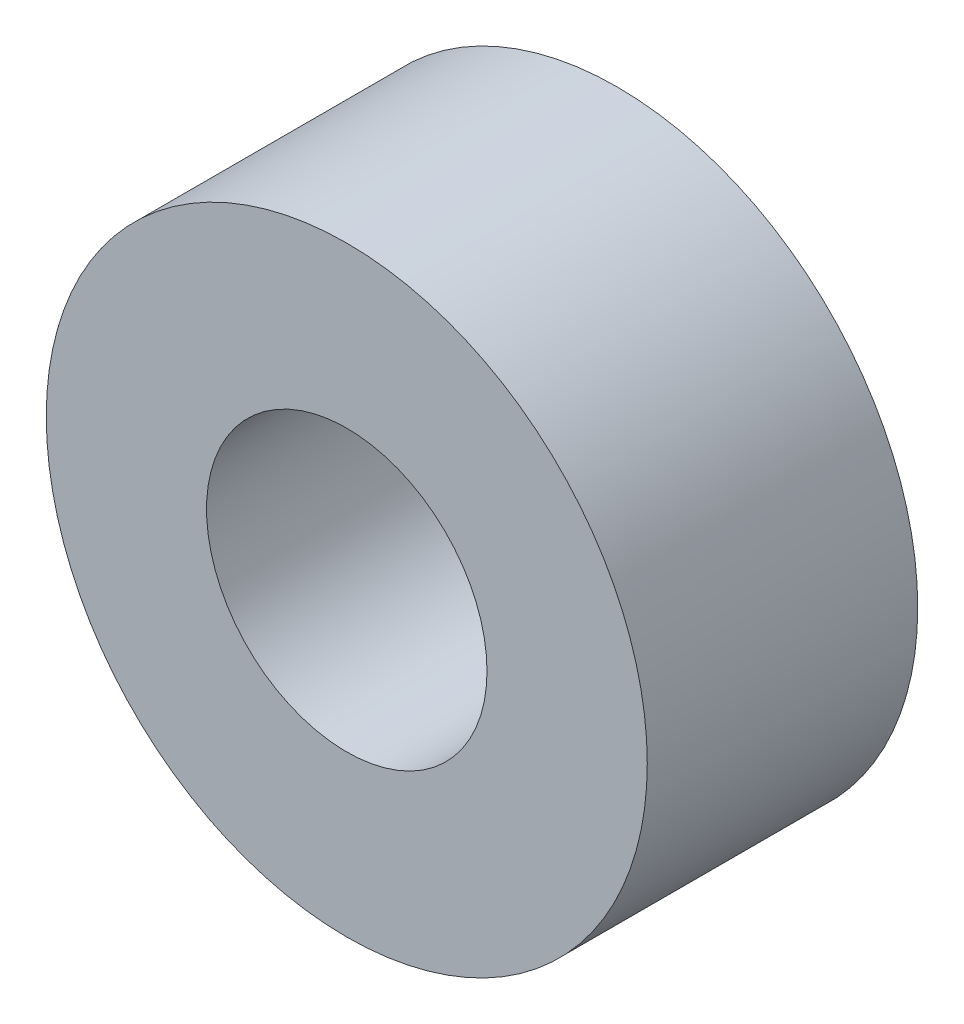
ISO-10303-21;
HEADER;
FILE_DESCRIPTION(('STEP AP214'),'2;1');
FILE_NAME('part.step','',(''),(''),'','','');
FILE_SCHEMA(('AUTOMOTIVE_DESIGN { 1 0 10303 214 1 1 1 1 }'));
ENDSEC;
DATA;
#1=APPLICATION_CONTEXT('core data for automotive mechanical design processes');
#2=APPLICATION_PROTOCOL_DEFINITION('international standard','automotive_design',2000,#1);
#3=PRODUCT_CONTEXT('',#1,'mechanical');
#4=PRODUCT('Part','Part','',(#3));
#5=PRODUCT_RELATED_PRODUCT_CATEGORY('part','',(#4));
#6=PRODUCT_DEFINITION_FORMATION('','',#4);
#7=PRODUCT_DEFINITION_CONTEXT('part definition',#1,'design');
#8=PRODUCT_DEFINITION('design','',#6,#7);
#9=PRODUCT_DEFINITION_SHAPE('','',#8);
#10=(LENGTH_UNIT() NAMED_UNIT(*) SI_UNIT(.MILLI.,.METRE.));
#11=(NAMED_UNIT(*) PLANE_ANGLE_UNIT() SI_UNIT($,.RADIAN.));
#12=(NAMED_UNIT(*) SI_UNIT($,.STERADIAN.) SOLID_ANGLE_UNIT());
#13=UNCERTAINTY_MEASURE_WITH_UNIT(LENGTH_MEASURE(1.E-05),#10,'distance_accuracy_value','');
#14=(GEOMETRIC_REPRESENTATION_CONTEXT(3) GLOBAL_UNCERTAINTY_ASSIGNED_CONTEXT((#13)) GLOBAL_UNIT_ASSIGNED_CONTEXT((#10,
#11,#12)) REPRESENTATION_CONTEXT('',''));
#15=CARTESIAN_POINT('',(0.,0.,0.));
#16=DIRECTION('',(0.,0.,1.));
#17=DIRECTION('',(1.,0.,0.));
#18=AXIS2_PLACEMENT_3D('',#15,#16,#17);
#19=CARTESIAN_POINT('',(0.,0.,-2.));
#20=DIRECTION('',(0.,0.,-1.));
#21=DIRECTION('',(1.,0.,0.));
#22=AXIS2_PLACEMENT_3D('',#19,#20,#21);
#23=PLANE('',#22);
#24=CARTESIAN_POINT('',(0.,0.,-2.));
#25=DIRECTION('',(0.,0.,1.));
#26=DIRECTION('',(1.,0.,0.));
#27=AXIS2_PLACEMENT_3D('',#24,#25,#26);
#28=CIRCLE('',#27,60.);
#29=CARTESIAN_POINT('',(60.,0.,-2.));
#30=VERTEX_POINT('',#29);
#31=EDGE_CURVE('E10',#30,#30,#28,.T.);
#32=ORIENTED_EDGE('',*,*,#31,.F.);
#33=EDGE_LOOP('',(#32));
#34=FACE_BOUND('',#33,.T.);
#35=CARTESIAN_POINT('',(0.,0.,-2.));
#36=DIRECTION('',(0.,0.,1.));
#37=DIRECTION('',(1.,0.,0.));
#38=AXIS2_PLACEMENT_3D('',#35,#36,#37);
#39=CIRCLE('',#38,28.);
#40=CARTESIAN_POINT('',(28.,0.,-2.));
#41=VERTEX_POINT('',#40);
#42=EDGE_CURVE('E42',#41,#41,#39,.T.);
#43=ORIENTED_EDGE('',*,*,#42,.T.);
#44=EDGE_LOOP('',(#43));
#45=FACE_BOUND('',#44,.T.);
#46=ADVANCED_FACE('F35',(#34,#45),#23,.T.);
#47=CARTESIAN_POINT('',(0.,0.,-2.));
#48=DIRECTION('',(0.,0.,1.));
#49=DIRECTION('',(-1.,0.,0.));
#50=AXIS2_PLACEMENT_3D('',#47,#48,#49);
#51=CYLINDRICAL_SURFACE('',#50,60.);
#52=ORIENTED_EDGE('',*,*,#31,.T.);
#53=EDGE_LOOP('',(#52));
#54=FACE_BOUND('',#53,.T.);
#55=CARTESIAN_POINT('',(0.,0.,52.));
#56=DIRECTION('',(0.,0.,1.));
#57=DIRECTION('',(1.,0.,0.));
#58=AXIS2_PLACEMENT_3D('',#55,#56,#57);
#59=CIRCLE('',#58,60.);
#60=CARTESIAN_POINT('',(60.,0.,52.));
#61=VERTEX_POINT('',#60);
#62=EDGE_CURVE('E46',#61,#61,#59,.T.);
#63=ORIENTED_EDGE('',*,*,#62,.F.);
#64=EDGE_LOOP('',(#63));
#65=FACE_BOUND('',#64,.T.);
#66=ADVANCED_FACE('F37',(#54,#65),#51,.T.);
#67=CARTESIAN_POINT('',(0.,0.,-2.));
#68=DIRECTION('',(0.,0.,1.));
#69=DIRECTION('',(-1.,0.,0.));
#70=AXIS2_PLACEMENT_3D('',#67,#68,#69);
#71=CYLINDRICAL_SURFACE('',#70,28.);
#72=ORIENTED_EDGE('',*,*,#42,.F.);
#73=EDGE_LOOP('',(#72));
#74=FACE_BOUND('',#73,.T.);
#75=CARTESIAN_POINT('',(0.,0.,52.));
#76=DIRECTION('',(0.,0.,1.));
#77=DIRECTION('',(1.,0.,0.));
#78=AXIS2_PLACEMENT_3D('',#75,#76,#77);
#79=CIRCLE('',#78,28.);
#80=CARTESIAN_POINT('',(28.,0.,52.));
#81=VERTEX_POINT('',#80);
#82=EDGE_CURVE('E50',#81,#81,#79,.T.);
#83=ORIENTED_EDGE('',*,*,#82,.T.);
#84=EDGE_LOOP('',(#83));
#85=FACE_BOUND('',#84,.T.);
#86=ADVANCED_FACE('F56',(#74,#85),#71,.F.);
#87=CARTESIAN_POINT('',(0.,0.,52.));
#88=DIRECTION('',(0.,0.,-1.));
#89=DIRECTION('',(1.,0.,0.));
#90=AXIS2_PLACEMENT_3D('',#87,#88,#89);
#91=PLANE('',#90);
#92=ORIENTED_EDGE('',*,*,#82,.F.);
#93=EDGE_LOOP('',(#92));
#94=FACE_BOUND('',#93,.T.);
#95=ORIENTED_EDGE('',*,*,#62,.T.);
#96=EDGE_LOOP('',(#95));
#97=FACE_BOUND('',#96,.T.);
#98=ADVANCED_FACE('F58',(#94,#97),#91,.F.);
#99=CLOSED_SHELL('',(#46,#66,#86,#98));
#100=MANIFOLD_SOLID_BREP('B2',#99);
#101=ADVANCED_BREP_SHAPE_REPRESENTATION('',(#18,#100),#14);
#102=SHAPE_DEFINITION_REPRESENTATION(#9,#101);
ENDSEC;
END-ISO-10303-21;
